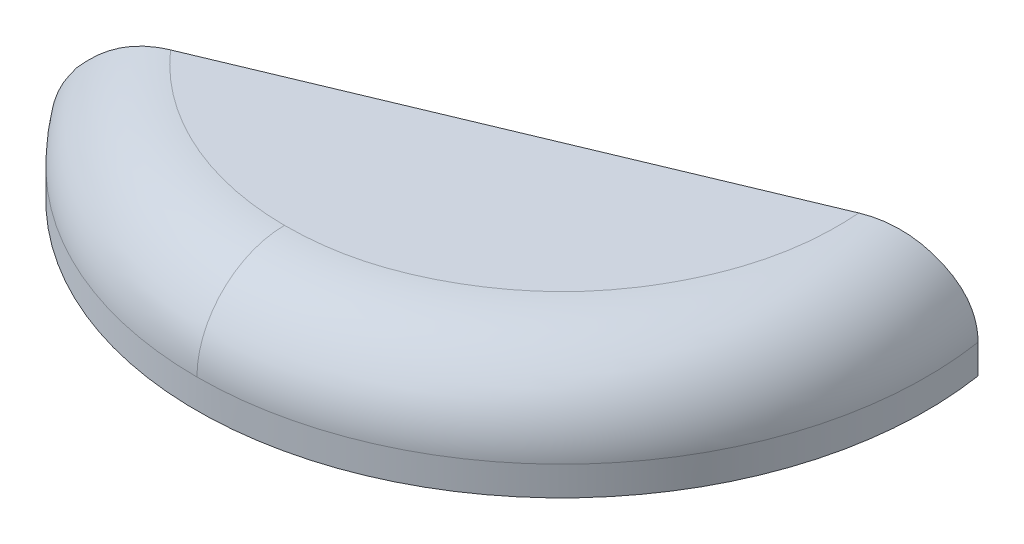
ISO-10303-21;
HEADER;
FILE_DESCRIPTION(('STEP AP214'),'2;1');
FILE_NAME('part.step','',(''),(''),'','','');
FILE_SCHEMA(('AUTOMOTIVE_DESIGN { 1 0 10303 214 1 1 1 1 }'));
ENDSEC;
DATA;
#1=APPLICATION_CONTEXT('core data for automotive mechanical design processes');
#2=APPLICATION_PROTOCOL_DEFINITION('international standard','automotive_design',2000,#1);
#3=PRODUCT_CONTEXT('',#1,'mechanical');
#4=PRODUCT('Part','Part','',(#3));
#5=PRODUCT_RELATED_PRODUCT_CATEGORY('part','',(#4));
#6=PRODUCT_DEFINITION_FORMATION('','',#4);
#7=PRODUCT_DEFINITION_CONTEXT('part definition',#1,'design');
#8=PRODUCT_DEFINITION('design','',#6,#7);
#9=PRODUCT_DEFINITION_SHAPE('','',#8);
#10=(LENGTH_UNIT() NAMED_UNIT(*) SI_UNIT(.MILLI.,.METRE.));
#11=(NAMED_UNIT(*) PLANE_ANGLE_UNIT() SI_UNIT($,.RADIAN.));
#12=(NAMED_UNIT(*) SI_UNIT($,.STERADIAN.) SOLID_ANGLE_UNIT());
#13=UNCERTAINTY_MEASURE_WITH_UNIT(LENGTH_MEASURE(1.E-05),#10,'distance_accuracy_value','');
#14=(GEOMETRIC_REPRESENTATION_CONTEXT(3) GLOBAL_UNCERTAINTY_ASSIGNED_CONTEXT((#13)) GLOBAL_UNIT_ASSIGNED_CONTEXT((#10,
#11,#12)) REPRESENTATION_CONTEXT('',''));
#15=CARTESIAN_POINT('',(0.,0.,0.));
#16=DIRECTION('',(0.,0.,1.));
#17=DIRECTION('',(1.,0.,0.));
#18=AXIS2_PLACEMENT_3D('',#15,#16,#17);
#19=CARTESIAN_POINT('',(5.302554399395,8.200000000604,-18.16644269149));
#20=DIRECTION('',(-3.483729926696E-10,-1.,-4.074344920015E-10));
#21=DIRECTION('',(0.,-4.074344920015E-10,1.));
#22=AXIS2_PLACEMENT_3D('',#19,#20,#21);
#23=TOROIDAL_SURFACE('',#22,0.950000000328,0.300000000248);
#24=CARTESIAN_POINT('',(5.302554399905,8.2,-18.16644269139));
#25=DIRECTION('',(0.,-1.,0.));
#26=DIRECTION('',(1.,0.,0.));
#27=AXIS2_PLACEMENT_3D('',#24,#25,#26);
#28=CIRCLE('',#27,1.25);
#29=CARTESIAN_POINT('',(6.53783293476172,8.199999999997,-18.3577198243486));
#30=VERTEX_POINT('',#29);
#31=CARTESIAN_POINT('',(5.302554399905,8.200000000008,-16.9164426912566));
#32=VERTEX_POINT('',#31);
#33=EDGE_CURVE('E70',#30,#32,#28,.T.);
#34=ORIENTED_EDGE('',*,*,#33,.F.);
#35=CARTESIAN_POINT('',(6.24990490958229,8.500000000469,-18.2373441110592));
#36=CARTESIAN_POINT('',(6.36235811398478,8.50000000052024,-18.2843580642203));
#37=CARTESIAN_POINT('',(6.45000042963042,8.41055480970835,-18.3209991874732));
#38=CARTESIAN_POINT('',(6.53783293487643,8.32091551693816,-18.3577198243781));
#39=CARTESIAN_POINT('',(6.53783293474661,8.199999999996,-18.3577198243238));
#40=B_SPLINE_CURVE_WITH_KNOTS('',2,(#35,#36,#37,#38,#39),.UNSPECIFIED.,.F.,.F.,(3,2,3),(0.,0.5,
1.),.UNSPECIFIED.);
#41=CARTESIAN_POINT('',(6.24990490967733,8.50000000031414,-18.2373441111237));
#42=VERTEX_POINT('',#41);
#43=EDGE_CURVE('E72',#42,#30,#40,.T.);
#44=ORIENTED_EDGE('',*,*,#43,.F.);
#45=CARTESIAN_POINT('',(5.302554399905,8.5,-17.2164426912));
#46=CARTESIAN_POINT('',(5.42866388480684,8.5,-17.2164426912));
#47=CARTESIAN_POINT('',(5.65915040813445,8.5,-17.2586601470442));
#48=CARTESIAN_POINT('',(6.01740598559168,8.5,-17.4905704128655));
#49=CARTESIAN_POINT('',(6.23166576433285,8.5,-17.865166293854));
#50=CARTESIAN_POINT('',(6.25958694822056,8.5,-18.1079773935836));
#51=CARTESIAN_POINT('',(6.24990490982,8.5,-18.23734411122));
#52=(BOUNDED_CURVE() B_SPLINE_CURVE(3,(#45,#46,#47,#48,#49,#50,#51),.UNSPECIFIED.,.F.,
.F.) B_SPLINE_CURVE_WITH_KNOTS((4,1,1,1,4),(0.,0.25,0.5,0.75,1.),
.UNSPECIFIED.) CURVE() GEOMETRIC_REPRESENTATION_ITEM() RATIONAL_B_SPLINE_CURVE((1.,1.,1.,1.,1.,
1.,1.)) REPRESENTATION_ITEM(''));
#53=CARTESIAN_POINT('',(5.30255439980363,8.50000000021849,-17.2164426912313));
#54=VERTEX_POINT('',#53);
#55=EDGE_CURVE('E11',#54,#42,#52,.T.);
#56=ORIENTED_EDGE('',*,*,#55,.F.);
#57=CARTESIAN_POINT('',(5.302554399905,8.199999999949,-17.21644269145));
#58=DIRECTION('',(-1.,0.,0.));
#59=DIRECTION('',(0.,-0.0998334163444368,0.995004165308366));
#60=AXIS2_PLACEMENT_3D('',#57,#58,#59);
#61=CIRCLE('',#60,0.30000000046);
#62=EDGE_CURVE('E45',#32,#54,#61,.T.);
#63=ORIENTED_EDGE('',*,*,#62,.F.);
#64=EDGE_LOOP('',(#34,#44,#56,#63));
#65=FACE_BOUND('',#64,.T.);
#66=ADVANCED_FACE('F17',(#65),#23,.T.);
#67=CARTESIAN_POINT('',(6.262549900905,8.5,-18.24346952039));
#68=DIRECTION('',(0.,-1.,0.));
#69=DIRECTION('',(0.,0.,-1.));
#70=AXIS2_PLACEMENT_3D('',#67,#68,#69);
#71=PLANE('',#70);
#72=CARTESIAN_POINT('',(5.30639401025816,8.5,-18.1748869019639));
#73=DIRECTION('',(0.,1.,0.));
#74=DIRECTION('',(-0.75095728644563,0.,0.660350780974942));
#75=AXIS2_PLACEMENT_3D('',#72,#73,#74);
#76=CIRCLE('',#75,0.95845190163858);
#77=CARTESIAN_POINT('',(4.58663757182233,8.500000000453,-17.5419724395875));
#78=VERTEX_POINT('',#77);
#79=EDGE_CURVE('E27',#78,#54,#76,.T.);
#80=ORIENTED_EDGE('',*,*,#79,.T.);
#81=ORIENTED_EDGE('',*,*,#55,.T.);
#82=DIRECTION('',(0.922614718858317,0.,-0.385722802730132));
#83=VECTOR('',#82,1.);
#84=CARTESIAN_POINT('',(5.418271240905,8.5,-17.88965827539));
#85=LINE('',#84,#83);
#86=EDGE_CURVE('E89',#78,#42,#85,.T.);
#87=ORIENTED_EDGE('',*,*,#86,.F.);
#88=EDGE_LOOP('',(#80,#81,#87));
#89=FACE_BOUND('',#88,.T.);
#90=ADVANCED_FACE('F19',(#89),#71,.F.);
#91=CARTESIAN_POINT('',(5.302554401078,8.200000007447,-18.16644269188));
#92=DIRECTION('',(3.825669377553E-09,-1.,-7.287995848828E-09));
#93=DIRECTION('',(0.,-7.287995848828E-09,1.));
#94=AXIS2_PLACEMENT_3D('',#91,#92,#93);
#95=TOROIDAL_SURFACE('',#94,0.950000000445,0.300000000749);
#96=CARTESIAN_POINT('',(4.29870954693057,8.200000000024,-17.4215967264008));
#97=CARTESIAN_POINT('',(4.29870954678554,8.31853848856887,-17.4215967263402));
#98=CARTESIAN_POINT('',(4.38586118110848,8.40977220634774,-17.4580327076511));
#99=CARTESIAN_POINT('',(4.47205190020532,8.50000000072392,-17.4940669536477));
#100=CARTESIAN_POINT('',(4.5866375719039,8.500000000906,-17.5419724395855));
#101=B_SPLINE_CURVE_WITH_KNOTS('',2,(#96,#97,#98,#99,#100),.UNSPECIFIED.,.F.,.F.,(3,2,3),(0.,
0.5,1.),.UNSPECIFIED.);
#102=CARTESIAN_POINT('',(4.2987095469884,8.200000000018,-17.4215967264639));
#103=VERTEX_POINT('',#102);
#104=EDGE_CURVE('E113',#103,#78,#101,.T.);
#105=ORIENTED_EDGE('',*,*,#104,.F.);
#106=CARTESIAN_POINT('',(5.302554399905,8.2,-18.16644269139));
#107=DIRECTION('',(0.,-1.,0.));
#108=DIRECTION('',(1.,0.,0.));
#109=AXIS2_PLACEMENT_3D('',#106,#107,#108);
#110=CIRCLE('',#109,1.25);
#111=EDGE_CURVE('E78',#32,#103,#110,.T.);
#112=ORIENTED_EDGE('',*,*,#111,.F.);
#113=ORIENTED_EDGE('',*,*,#62,.T.);
#114=ORIENTED_EDGE('',*,*,#79,.F.);
#115=EDGE_LOOP('',(#105,#112,#113,#114));
#116=FACE_BOUND('',#115,.T.);
#117=ADVANCED_FACE('F149',(#116),#95,.T.);
#118=CARTESIAN_POINT('',(6.552656276905,8.1,-18.92022680739));
#119=DIRECTION('',(0.,-1.,0.));
#120=DIRECTION('',(0.,0.,-1.));
#121=AXIS2_PLACEMENT_3D('',#118,#119,#120);
#122=PLANE('',#121);
#123=CARTESIAN_POINT('',(5.302554399905,8.1000000004,-18.16644269139));
#124=DIRECTION('',(0.,-1.,0.));
#125=DIRECTION('',(1.,0.,0.));
#126=AXIS2_PLACEMENT_3D('',#123,#124,#125);
#127=CIRCLE('',#126,1.25);
#128=CARTESIAN_POINT('',(6.53783293480034,8.10000000016667,-18.3577198243685));
#129=VERTEX_POINT('',#128);
#130=CARTESIAN_POINT('',(4.29870954697046,8.10000000016667,-17.4215967264338));
#131=VERTEX_POINT('',#130);
#132=EDGE_CURVE('E79',#129,#131,#127,.T.);
#133=ORIENTED_EDGE('',*,*,#132,.T.);
#134=DIRECTION('',(-0.922614718858317,0.,0.385722802730132));
#135=VECTOR('',#134,1.);
#136=CARTESIAN_POINT('',(6.537832934905,8.1,-18.35771982439));
#137=LINE('',#136,#135);
#138=EDGE_CURVE('E97',#129,#131,#137,.T.);
#139=ORIENTED_EDGE('',*,*,#138,.F.);
#140=EDGE_LOOP('',(#133,#139));
#141=FACE_BOUND('',#140,.T.);
#142=ADVANCED_FACE('F148',(#141),#122,.T.);
#143=CARTESIAN_POINT('',(5.302554399905,8.2,-18.16644269139));
#144=DIRECTION('',(0.,-1.,0.));
#145=DIRECTION('',(-1.,0.,0.));
#146=AXIS2_PLACEMENT_3D('',#143,#144,#145);
#147=CYLINDRICAL_SURFACE('',#146,1.25);
#148=DIRECTION('',(0.,1.,0.));
#149=VECTOR('',#148,1.);
#150=CARTESIAN_POINT('',(4.298709546905,8.3,-17.42159672639));
#151=LINE('',#150,#149);
#152=EDGE_CURVE('E103',#131,#103,#151,.T.);
#153=ORIENTED_EDGE('',*,*,#152,.F.);
#154=ORIENTED_EDGE('',*,*,#132,.F.);
#155=DIRECTION('',(0.,-1.,0.));
#156=VECTOR('',#155,1.);
#157=CARTESIAN_POINT('',(6.537832934905,8.3,-18.35771982439));
#158=LINE('',#157,#156);
#159=EDGE_CURVE('E86',#30,#129,#158,.T.);
#160=ORIENTED_EDGE('',*,*,#159,.F.);
#161=ORIENTED_EDGE('',*,*,#33,.T.);
#162=ORIENTED_EDGE('',*,*,#111,.T.);
#163=EDGE_LOOP('',(#153,#154,#160,#161,#162));
#164=FACE_BOUND('',#163,.T.);
#165=ADVANCED_FACE('F94',(#164),#147,.T.);
#166=CARTESIAN_POINT('',(6.537832934905,8.1,-18.35771982439));
#167=DIRECTION('',(-0.385722802730132,0.,-0.922614718858317));
#168=DIRECTION('',(-0.922614718858317,0.,0.385722802730132));
#169=AXIS2_PLACEMENT_3D('',#166,#167,#168);
#170=PLANE('',#169);
#171=ORIENTED_EDGE('',*,*,#159,.T.);
#172=ORIENTED_EDGE('',*,*,#138,.T.);
#173=ORIENTED_EDGE('',*,*,#152,.T.);
#174=ORIENTED_EDGE('',*,*,#104,.T.);
#175=ORIENTED_EDGE('',*,*,#86,.T.);
#176=ORIENTED_EDGE('',*,*,#43,.T.);
#177=EDGE_LOOP('',(#171,#172,#173,#174,#175,#176));
#178=FACE_BOUND('',#177,.T.);
#179=ADVANCED_FACE('F84',(#178),#170,.T.);
#180=CLOSED_SHELL('',(#66,#90,#117,#142,#165,#179));
#181=MANIFOLD_SOLID_BREP('B1',#180);
#182=ADVANCED_BREP_SHAPE_REPRESENTATION('',(#18,#181),#14);
#183=SHAPE_DEFINITION_REPRESENTATION(#9,#182);
ENDSEC;
END-ISO-10303-21;
